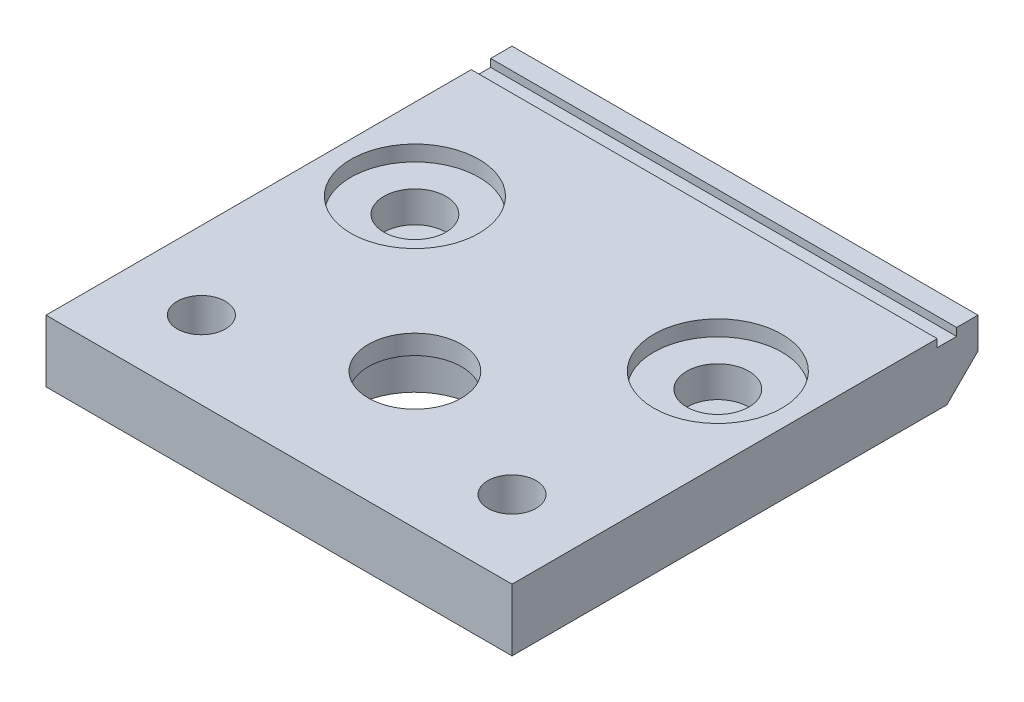
ISO-10303-21;
HEADER;
FILE_DESCRIPTION(('STEP AP214'),'2;1');
FILE_NAME('part.step','',(''),(''),'','','');
FILE_SCHEMA(('AUTOMOTIVE_DESIGN { 1 0 10303 214 1 1 1 1 }'));
ENDSEC;
DATA;
#1=APPLICATION_CONTEXT('core data for automotive mechanical design processes');
#2=APPLICATION_PROTOCOL_DEFINITION('international standard','automotive_design',2000,#1);
#3=PRODUCT_CONTEXT('',#1,'mechanical');
#4=PRODUCT('Part','Part','',(#3));
#5=PRODUCT_RELATED_PRODUCT_CATEGORY('part','',(#4));
#6=PRODUCT_DEFINITION_FORMATION('','',#4);
#7=PRODUCT_DEFINITION_CONTEXT('part definition',#1,'design');
#8=PRODUCT_DEFINITION('design','',#6,#7);
#9=PRODUCT_DEFINITION_SHAPE('','',#8);
#10=(LENGTH_UNIT() NAMED_UNIT(*) SI_UNIT(.MILLI.,.METRE.));
#11=(NAMED_UNIT(*) PLANE_ANGLE_UNIT() SI_UNIT($,.RADIAN.));
#12=(NAMED_UNIT(*) SI_UNIT($,.STERADIAN.) SOLID_ANGLE_UNIT());
#13=UNCERTAINTY_MEASURE_WITH_UNIT(LENGTH_MEASURE(1.E-05),#10,'distance_accuracy_value','');
#14=(GEOMETRIC_REPRESENTATION_CONTEXT(3) GLOBAL_UNCERTAINTY_ASSIGNED_CONTEXT((#13)) GLOBAL_UNIT_ASSIGNED_CONTEXT((#10,
#11,#12)) REPRESENTATION_CONTEXT('',''));
#15=CARTESIAN_POINT('',(0.,0.,0.));
#16=DIRECTION('',(0.,0.,1.));
#17=DIRECTION('',(1.,0.,0.));
#18=AXIS2_PLACEMENT_3D('',#15,#16,#17);
#19=CARTESIAN_POINT('',(0.,8.,0.));
#20=DIRECTION('',(0.,1.,0.));
#21=DIRECTION('',(0.,0.,1.));
#22=AXIS2_PLACEMENT_3D('',#19,#20,#21);
#23=PLANE('',#22);
#24=DIRECTION('',(1.,0.,0.));
#25=VECTOR('',#24,1.);
#26=CARTESIAN_POINT('',(-30.,8.,-24.75));
#27=LINE('',#26,#25);
#28=CARTESIAN_POINT('',(-30.,8.,-24.75));
#29=VERTEX_POINT('',#28);
#30=CARTESIAN_POINT('',(30.,8.,-24.75));
#31=VERTEX_POINT('',#30);
#32=EDGE_CURVE('E157',#29,#31,#27,.T.);
#33=ORIENTED_EDGE('',*,*,#32,.F.);
#34=DIRECTION('',(0.,0.,1.));
#35=VECTOR('',#34,1.);
#36=CARTESIAN_POINT('',(-30.,8.,0.));
#37=LINE('',#36,#35);
#38=CARTESIAN_POINT('',(-30.,8.,30.));
#39=VERTEX_POINT('',#38);
#40=EDGE_CURVE('E141',#29,#39,#37,.T.);
#41=ORIENTED_EDGE('',*,*,#40,.T.);
#42=DIRECTION('',(1.,0.,0.));
#43=VECTOR('',#42,1.);
#44=CARTESIAN_POINT('',(0.,8.,30.));
#45=LINE('',#44,#43);
#46=CARTESIAN_POINT('',(30.,8.,30.));
#47=VERTEX_POINT('',#46);
#48=EDGE_CURVE('E245',#39,#47,#45,.T.);
#49=ORIENTED_EDGE('',*,*,#48,.T.);
#50=DIRECTION('',(0.,0.,1.));
#51=VECTOR('',#50,1.);
#52=CARTESIAN_POINT('',(30.,8.,0.));
#53=LINE('',#52,#51);
#54=EDGE_CURVE('E231',#31,#47,#53,.T.);
#55=ORIENTED_EDGE('',*,*,#54,.F.);
#56=EDGE_LOOP('',(#33,#41,#49,#55));
#57=FACE_BOUND('',#56,.T.);
#58=CARTESIAN_POINT('',(-20.,8.,20.));
#59=DIRECTION('',(0.,-1.,0.));
#60=DIRECTION('',(0.,0.,-1.));
#61=AXIS2_PLACEMENT_3D('',#58,#59,#60);
#62=CIRCLE('',#61,3.1);
#63=CARTESIAN_POINT('',(-20.,8.,16.9));
#64=VERTEX_POINT('',#63);
#65=EDGE_CURVE('E174',#64,#64,#62,.T.);
#66=ORIENTED_EDGE('',*,*,#65,.T.);
#67=EDGE_LOOP('',(#66));
#68=FACE_BOUND('',#67,.T.);
#69=CARTESIAN_POINT('',(0.,8.,12.5));
#70=DIRECTION('',(0.,1.,0.));
#71=DIRECTION('',(0.,0.,1.));
#72=AXIS2_PLACEMENT_3D('',#69,#70,#71);
#73=CIRCLE('',#72,6.);
#74=CARTESIAN_POINT('',(0.,8.,18.5));
#75=VERTEX_POINT('',#74);
#76=EDGE_CURVE('E227',#75,#75,#73,.T.);
#77=ORIENTED_EDGE('',*,*,#76,.F.);
#78=EDGE_LOOP('',(#77));
#79=FACE_BOUND('',#78,.T.);
#80=CARTESIAN_POINT('',(19.5,8.,-6.99999999999999));
#81=DIRECTION('',(0.,1.,0.));
#82=DIRECTION('',(0.,0.,1.));
#83=AXIS2_PLACEMENT_3D('',#80,#81,#82);
#84=CIRCLE('',#83,8.25);
#85=CARTESIAN_POINT('',(19.5,8.,1.25000000000001));
#86=VERTEX_POINT('',#85);
#87=EDGE_CURVE('E189',#86,#86,#84,.T.);
#88=ORIENTED_EDGE('',*,*,#87,.F.);
#89=EDGE_LOOP('',(#88));
#90=FACE_BOUND('',#89,.T.);
#91=CARTESIAN_POINT('',(-19.5,8.,-6.99999999999999));
#92=DIRECTION('',(0.,1.,0.));
#93=DIRECTION('',(0.,0.,1.));
#94=AXIS2_PLACEMENT_3D('',#91,#92,#93);
#95=CIRCLE('',#94,8.25);
#96=CARTESIAN_POINT('',(-19.5,8.,1.25000000000001));
#97=VERTEX_POINT('',#96);
#98=EDGE_CURVE('E195',#97,#97,#95,.T.);
#99=ORIENTED_EDGE('',*,*,#98,.F.);
#100=EDGE_LOOP('',(#99));
#101=FACE_BOUND('',#100,.T.);
#102=CARTESIAN_POINT('',(20.,8.,20.));
#103=DIRECTION('',(0.,-1.,0.));
#104=DIRECTION('',(0.,0.,-1.));
#105=AXIS2_PLACEMENT_3D('',#102,#103,#104);
#106=CIRCLE('',#105,3.1);
#107=CARTESIAN_POINT('',(20.,8.,16.9));
#108=VERTEX_POINT('',#107);
#109=EDGE_CURVE('E186',#108,#108,#106,.T.);
#110=ORIENTED_EDGE('',*,*,#109,.T.);
#111=EDGE_LOOP('',(#110));
#112=FACE_BOUND('',#111,.T.);
#113=ADVANCED_FACE('F47',(#57,#68,#79,#90,#101,#112),#23,.T.);
#114=DIRECTION('',(1.,0.,0.));
#115=VECTOR('',#114,1.);
#116=CARTESIAN_POINT('',(-30.,8.,-27.25));
#117=LINE('',#116,#115);
#118=CARTESIAN_POINT('',(-30.,8.,-27.25));
#119=VERTEX_POINT('',#118);
#120=CARTESIAN_POINT('',(30.,8.,-27.25));
#121=VERTEX_POINT('',#120);
#122=EDGE_CURVE('E161',#119,#121,#117,.T.);
#123=ORIENTED_EDGE('',*,*,#122,.T.);
#124=CARTESIAN_POINT('',(30.,8.,-30.));
#125=VERTEX_POINT('',#124);
#126=EDGE_CURVE('E233',#125,#121,#53,.T.);
#127=ORIENTED_EDGE('',*,*,#126,.F.);
#128=DIRECTION('',(1.,0.,0.));
#129=VECTOR('',#128,1.);
#130=CARTESIAN_POINT('',(0.,8.,-30.));
#131=LINE('',#130,#129);
#132=CARTESIAN_POINT('',(-30.,8.,-30.));
#133=VERTEX_POINT('',#132);
#134=EDGE_CURVE('E237',#133,#125,#131,.T.);
#135=ORIENTED_EDGE('',*,*,#134,.F.);
#136=EDGE_CURVE('E241',#133,#119,#37,.T.);
#137=ORIENTED_EDGE('',*,*,#136,.T.);
#138=EDGE_LOOP('',(#123,#127,#135,#137));
#139=FACE_BOUND('',#138,.T.);
#140=ADVANCED_FACE('F308',(#139),#23,.T.);
#141=CARTESIAN_POINT('',(30.,8.,0.));
#142=DIRECTION('',(1.,0.,0.));
#143=DIRECTION('',(0.,0.,-1.));
#144=AXIS2_PLACEMENT_3D('',#141,#142,#143);
#145=PLANE('',#144);
#146=DIRECTION('',(0.,-1.,0.));
#147=VECTOR('',#146,1.);
#148=CARTESIAN_POINT('',(30.,7.,-24.75));
#149=LINE('',#148,#147);
#150=CARTESIAN_POINT('',(30.,7.,-24.75));
#151=VERTEX_POINT('',#150);
#152=EDGE_CURVE('E125',#31,#151,#149,.T.);
#153=ORIENTED_EDGE('',*,*,#152,.F.);
#154=ORIENTED_EDGE('',*,*,#54,.T.);
#155=DIRECTION('',(0.,-1.,0.));
#156=VECTOR('',#155,1.);
#157=CARTESIAN_POINT('',(30.,8.,30.));
#158=LINE('',#157,#156);
#159=CARTESIAN_POINT('',(30.,0.,30.));
#160=VERTEX_POINT('',#159);
#161=EDGE_CURVE('E249',#47,#160,#158,.T.);
#162=ORIENTED_EDGE('',*,*,#161,.T.);
#163=DIRECTION('',(0.,0.,1.));
#164=VECTOR('',#163,1.);
#165=CARTESIAN_POINT('',(30.,0.,0.));
#166=LINE('',#165,#164);
#167=CARTESIAN_POINT('',(30.,0.,-26.));
#168=VERTEX_POINT('',#167);
#169=EDGE_CURVE('E223',#168,#160,#166,.T.);
#170=ORIENTED_EDGE('',*,*,#169,.F.);
#171=DIRECTION('',(0.,0.707106781186549,-0.707106781186546));
#172=VECTOR('',#171,1.);
#173=CARTESIAN_POINT('',(30.,-8.99999999999999,-17.));
#174=LINE('',#173,#172);
#175=CARTESIAN_POINT('',(30.,4.00000000000001,-30.));
#176=VERTEX_POINT('',#175);
#177=EDGE_CURVE('E281',#168,#176,#174,.T.);
#178=ORIENTED_EDGE('',*,*,#177,.T.);
#179=DIRECTION('',(0.,-1.,0.));
#180=VECTOR('',#179,1.);
#181=CARTESIAN_POINT('',(30.,8.,-30.));
#182=LINE('',#181,#180);
#183=EDGE_CURVE('E268',#125,#176,#182,.T.);
#184=ORIENTED_EDGE('',*,*,#183,.F.);
#185=ORIENTED_EDGE('',*,*,#126,.T.);
#186=DIRECTION('',(0.,1.,0.));
#187=VECTOR('',#186,1.);
#188=CARTESIAN_POINT('',(30.,8.,-27.25));
#189=LINE('',#188,#187);
#190=CARTESIAN_POINT('',(30.,7.,-27.25));
#191=VERTEX_POINT('',#190);
#192=EDGE_CURVE('E143',#191,#121,#189,.T.);
#193=ORIENTED_EDGE('',*,*,#192,.F.);
#194=DIRECTION('',(0.,0.,-1.));
#195=VECTOR('',#194,1.);
#196=CARTESIAN_POINT('',(30.,7.,-27.25));
#197=LINE('',#196,#195);
#198=EDGE_CURVE('E148',#151,#191,#197,.T.);
#199=ORIENTED_EDGE('',*,*,#198,.F.);
#200=EDGE_LOOP('',(#153,#154,#162,#170,#178,#184,#185,#193,#199));
#201=FACE_BOUND('',#200,.T.);
#202=ADVANCED_FACE('F288',(#201),#145,.T.);
#203=CARTESIAN_POINT('',(0.,8.,-30.));
#204=DIRECTION('',(0.,0.,-1.));
#205=DIRECTION('',(-1.,0.,0.));
#206=AXIS2_PLACEMENT_3D('',#203,#204,#205);
#207=PLANE('',#206);
#208=ORIENTED_EDGE('',*,*,#183,.T.);
#209=DIRECTION('',(-1.,0.,0.));
#210=VECTOR('',#209,1.);
#211=CARTESIAN_POINT('',(-30.,4.00000000000001,-30.));
#212=LINE('',#211,#210);
#213=CARTESIAN_POINT('',(-30.,4.00000000000001,-30.));
#214=VERTEX_POINT('',#213);
#215=EDGE_CURVE('E57',#176,#214,#212,.T.);
#216=ORIENTED_EDGE('',*,*,#215,.T.);
#217=DIRECTION('',(0.,-1.,0.));
#218=VECTOR('',#217,1.);
#219=CARTESIAN_POINT('',(-30.,8.,-30.));
#220=LINE('',#219,#218);
#221=EDGE_CURVE('E265',#133,#214,#220,.T.);
#222=ORIENTED_EDGE('',*,*,#221,.F.);
#223=ORIENTED_EDGE('',*,*,#134,.T.);
#224=EDGE_LOOP('',(#208,#216,#222,#223));
#225=FACE_BOUND('',#224,.T.);
#226=ADVANCED_FACE('F303',(#225),#207,.T.);
#227=CARTESIAN_POINT('',(-30.,8.,0.));
#228=DIRECTION('',(1.,0.,0.));
#229=DIRECTION('',(0.,0.,-1.));
#230=AXIS2_PLACEMENT_3D('',#227,#228,#229);
#231=PLANE('',#230);
#232=ORIENTED_EDGE('',*,*,#40,.F.);
#233=DIRECTION('',(0.,-1.,0.));
#234=VECTOR('',#233,1.);
#235=CARTESIAN_POINT('',(-30.,7.,-24.75));
#236=LINE('',#235,#234);
#237=CARTESIAN_POINT('',(-30.,7.,-24.75));
#238=VERTEX_POINT('',#237);
#239=EDGE_CURVE('E122',#29,#238,#236,.T.);
#240=ORIENTED_EDGE('',*,*,#239,.T.);
#241=DIRECTION('',(0.,0.,-1.));
#242=VECTOR('',#241,1.);
#243=CARTESIAN_POINT('',(-30.,7.,-27.25));
#244=LINE('',#243,#242);
#245=CARTESIAN_POINT('',(-30.,7.,-27.25));
#246=VERTEX_POINT('',#245);
#247=EDGE_CURVE('E133',#238,#246,#244,.T.);
#248=ORIENTED_EDGE('',*,*,#247,.T.);
#249=DIRECTION('',(0.,1.,0.));
#250=VECTOR('',#249,1.);
#251=CARTESIAN_POINT('',(-30.,8.,-27.25));
#252=LINE('',#251,#250);
#253=EDGE_CURVE('E64',#246,#119,#252,.T.);
#254=ORIENTED_EDGE('',*,*,#253,.T.);
#255=ORIENTED_EDGE('',*,*,#136,.F.);
#256=ORIENTED_EDGE('',*,*,#221,.T.);
#257=DIRECTION('',(0.,-0.707106781186549,0.707106781186546));
#258=VECTOR('',#257,1.);
#259=CARTESIAN_POINT('',(-30.,0.,-26.));
#260=LINE('',#259,#258);
#261=CARTESIAN_POINT('',(-30.,0.,-26.));
#262=VERTEX_POINT('',#261);
#263=EDGE_CURVE('E11',#214,#262,#260,.T.);
#264=ORIENTED_EDGE('',*,*,#263,.T.);
#265=DIRECTION('',(0.,0.,1.));
#266=VECTOR('',#265,1.);
#267=CARTESIAN_POINT('',(-30.,0.,0.));
#268=LINE('',#267,#266);
#269=CARTESIAN_POINT('',(-30.,0.,30.));
#270=VERTEX_POINT('',#269);
#271=EDGE_CURVE('E252',#262,#270,#268,.T.);
#272=ORIENTED_EDGE('',*,*,#271,.T.);
#273=DIRECTION('',(0.,-1.,0.));
#274=VECTOR('',#273,1.);
#275=CARTESIAN_POINT('',(-30.,8.,30.));
#276=LINE('',#275,#274);
#277=EDGE_CURVE('E261',#39,#270,#276,.T.);
#278=ORIENTED_EDGE('',*,*,#277,.F.);
#279=EDGE_LOOP('',(#232,#240,#248,#254,#255,#256,#264,#272,#278));
#280=FACE_BOUND('',#279,.T.);
#281=ADVANCED_FACE('F139',(#280),#231,.F.);
#282=CARTESIAN_POINT('',(0.,8.,30.));
#283=DIRECTION('',(0.,0.,-1.));
#284=DIRECTION('',(-1.,0.,0.));
#285=AXIS2_PLACEMENT_3D('',#282,#283,#284);
#286=PLANE('',#285);
#287=DIRECTION('',(1.,0.,0.));
#288=VECTOR('',#287,1.);
#289=CARTESIAN_POINT('',(0.,0.,30.));
#290=LINE('',#289,#288);
#291=EDGE_CURVE('E232',#270,#160,#290,.T.);
#292=ORIENTED_EDGE('',*,*,#291,.T.);
#293=ORIENTED_EDGE('',*,*,#161,.F.);
#294=ORIENTED_EDGE('',*,*,#48,.F.);
#295=ORIENTED_EDGE('',*,*,#277,.T.);
#296=EDGE_LOOP('',(#292,#293,#294,#295));
#297=FACE_BOUND('',#296,.T.);
#298=ADVANCED_FACE('F295',(#297),#286,.F.);
#299=CARTESIAN_POINT('',(0.,8.,12.5));
#300=DIRECTION('',(0.,-1.,0.));
#301=DIRECTION('',(0.,0.,-1.));
#302=AXIS2_PLACEMENT_3D('',#299,#300,#301);
#303=CYLINDRICAL_SURFACE('',#302,6.);
#304=CARTESIAN_POINT('',(0.,5.5,12.5));
#305=DIRECTION('',(0.,1.,0.));
#306=DIRECTION('',(0.,0.,1.));
#307=AXIS2_PLACEMENT_3D('',#304,#305,#306);
#308=CIRCLE('',#307,6.);
#309=CARTESIAN_POINT('',(0.,5.5,18.5));
#310=VERTEX_POINT('',#309);
#311=EDGE_CURVE('E206',#310,#310,#308,.T.);
#312=ORIENTED_EDGE('',*,*,#311,.F.);
#313=EDGE_LOOP('',(#312));
#314=FACE_BOUND('',#313,.T.);
#315=ORIENTED_EDGE('',*,*,#76,.T.);
#316=EDGE_LOOP('',(#315));
#317=FACE_BOUND('',#316,.T.);
#318=ADVANCED_FACE('F332',(#314,#317),#303,.F.);
#319=CARTESIAN_POINT('',(0.,0.,0.));
#320=DIRECTION('',(0.,1.,0.));
#321=DIRECTION('',(0.,0.,1.));
#322=AXIS2_PLACEMENT_3D('',#319,#320,#321);
#323=PLANE('',#322);
#324=CARTESIAN_POINT('',(-20.,0.,20.));
#325=DIRECTION('',(0.,-1.,0.));
#326=DIRECTION('',(0.,0.,-1.));
#327=AXIS2_PLACEMENT_3D('',#324,#325,#326);
#328=CIRCLE('',#327,6.25);
#329=CARTESIAN_POINT('',(-20.,0.,13.75));
#330=VERTEX_POINT('',#329);
#331=EDGE_CURVE('E160',#330,#330,#328,.T.);
#332=ORIENTED_EDGE('',*,*,#331,.F.);
#333=EDGE_LOOP('',(#332));
#334=FACE_BOUND('',#333,.T.);
#335=CARTESIAN_POINT('',(20.,0.,20.));
#336=DIRECTION('',(0.,-1.,0.));
#337=DIRECTION('',(0.,0.,-1.));
#338=AXIS2_PLACEMENT_3D('',#335,#336,#337);
#339=CIRCLE('',#338,6.25);
#340=CARTESIAN_POINT('',(20.,0.,13.75));
#341=VERTEX_POINT('',#340);
#342=EDGE_CURVE('E178',#341,#341,#339,.T.);
#343=ORIENTED_EDGE('',*,*,#342,.F.);
#344=EDGE_LOOP('',(#343));
#345=FACE_BOUND('',#344,.T.);
#346=CARTESIAN_POINT('',(0.,0.,12.5));
#347=DIRECTION('',(0.,1.,0.));
#348=DIRECTION('',(0.,0.,1.));
#349=AXIS2_PLACEMENT_3D('',#346,#347,#348);
#350=CIRCLE('',#349,8.);
#351=CARTESIAN_POINT('',(0.,0.,20.5));
#352=VERTEX_POINT('',#351);
#353=EDGE_CURVE('E210',#352,#352,#350,.T.);
#354=ORIENTED_EDGE('',*,*,#353,.T.);
#355=EDGE_LOOP('',(#354));
#356=FACE_BOUND('',#355,.T.);
#357=ORIENTED_EDGE('',*,*,#271,.F.);
#358=DIRECTION('',(1.,0.,0.));
#359=VECTOR('',#358,1.);
#360=CARTESIAN_POINT('',(30.,0.,-26.));
#361=LINE('',#360,#359);
#362=EDGE_CURVE('E271',#262,#168,#361,.T.);
#363=ORIENTED_EDGE('',*,*,#362,.T.);
#364=ORIENTED_EDGE('',*,*,#169,.T.);
#365=ORIENTED_EDGE('',*,*,#291,.F.);
#366=EDGE_LOOP('',(#357,#363,#364,#365));
#367=FACE_BOUND('',#366,.T.);
#368=ADVANCED_FACE('F299',(#334,#345,#356,#367),#323,.F.);
#369=CARTESIAN_POINT('',(0.,5.5,12.5));
#370=DIRECTION('',(0.,-1.,0.));
#371=DIRECTION('',(0.,0.,-1.));
#372=AXIS2_PLACEMENT_3D('',#369,#370,#371);
#373=CYLINDRICAL_SURFACE('',#372,8.);
#374=CARTESIAN_POINT('',(0.,5.5,12.5));
#375=DIRECTION('',(0.,1.,0.));
#376=DIRECTION('',(0.,0.,1.));
#377=AXIS2_PLACEMENT_3D('',#374,#375,#376);
#378=CIRCLE('',#377,8.);
#379=CARTESIAN_POINT('',(0.,5.5,20.5));
#380=VERTEX_POINT('',#379);
#381=EDGE_CURVE('E209',#380,#380,#378,.T.);
#382=ORIENTED_EDGE('',*,*,#381,.T.);
#383=EDGE_LOOP('',(#382));
#384=FACE_BOUND('',#383,.T.);
#385=ORIENTED_EDGE('',*,*,#353,.F.);
#386=EDGE_LOOP('',(#385));
#387=FACE_BOUND('',#386,.T.);
#388=ADVANCED_FACE('F331',(#384,#387),#373,.F.);
#389=CARTESIAN_POINT('',(0.,5.5,0.));
#390=DIRECTION('',(0.,1.,0.));
#391=DIRECTION('',(0.,0.,1.));
#392=AXIS2_PLACEMENT_3D('',#389,#390,#391);
#393=PLANE('',#392);
#394=ORIENTED_EDGE('',*,*,#311,.T.);
#395=EDGE_LOOP('',(#394));
#396=FACE_BOUND('',#395,.T.);
#397=ORIENTED_EDGE('',*,*,#381,.F.);
#398=EDGE_LOOP('',(#397));
#399=FACE_BOUND('',#398,.T.);
#400=ADVANCED_FACE('F373',(#396,#399),#393,.F.);
#401=CARTESIAN_POINT('',(-19.5,6.,-6.99999999999999));
#402=DIRECTION('',(0.,1.,0.));
#403=DIRECTION('',(0.,0.,1.));
#404=AXIS2_PLACEMENT_3D('',#401,#402,#403);
#405=PLANE('',#404);
#406=CARTESIAN_POINT('',(-19.5,6.,-6.99999999999999));
#407=DIRECTION('',(0.,1.,0.));
#408=DIRECTION('',(0.,0.,1.));
#409=AXIS2_PLACEMENT_3D('',#406,#407,#408);
#410=CIRCLE('',#409,8.25);
#411=CARTESIAN_POINT('',(-19.5,6.,1.25000000000001));
#412=VERTEX_POINT('',#411);
#413=EDGE_CURVE('E190',#412,#412,#410,.T.);
#414=ORIENTED_EDGE('',*,*,#413,.T.);
#415=EDGE_LOOP('',(#414));
#416=FACE_BOUND('',#415,.T.);
#417=CARTESIAN_POINT('',(-19.5,6.,-6.99999999999999));
#418=DIRECTION('',(0.,1.,0.));
#419=DIRECTION('',(0.,0.,1.));
#420=AXIS2_PLACEMENT_3D('',#417,#418,#419);
#421=CIRCLE('',#420,4.);
#422=CARTESIAN_POINT('',(-19.5,6.,-2.99999999999999));
#423=VERTEX_POINT('',#422);
#424=EDGE_CURVE('E194',#423,#423,#421,.F.);
#425=ORIENTED_EDGE('',*,*,#424,.T.);
#426=EDGE_LOOP('',(#425));
#427=FACE_BOUND('',#426,.T.);
#428=ADVANCED_FACE('F379',(#416,#427),#405,.T.);
#429=CARTESIAN_POINT('',(-19.5,6.,-6.99999999999999));
#430=DIRECTION('',(0.,1.,0.));
#431=DIRECTION('',(0.,0.,1.));
#432=AXIS2_PLACEMENT_3D('',#429,#430,#431);
#433=CYLINDRICAL_SURFACE('',#432,8.25);
#434=ORIENTED_EDGE('',*,*,#413,.F.);
#435=EDGE_LOOP('',(#434));
#436=FACE_BOUND('',#435,.T.);
#437=ORIENTED_EDGE('',*,*,#98,.T.);
#438=EDGE_LOOP('',(#437));
#439=FACE_BOUND('',#438,.T.);
#440=ADVANCED_FACE('F405',(#436,#439),#433,.F.);
#441=CARTESIAN_POINT('',(19.5,6.,-6.99999999999999));
#442=DIRECTION('',(0.,1.,0.));
#443=DIRECTION('',(0.,0.,1.));
#444=AXIS2_PLACEMENT_3D('',#441,#442,#443);
#445=PLANE('',#444);
#446=CARTESIAN_POINT('',(19.5,6.,-6.99999999999999));
#447=DIRECTION('',(0.,1.,0.));
#448=DIRECTION('',(0.,0.,1.));
#449=AXIS2_PLACEMENT_3D('',#446,#447,#448);
#450=CIRCLE('',#449,8.25);
#451=CARTESIAN_POINT('',(19.5,6.,1.25000000000001));
#452=VERTEX_POINT('',#451);
#453=EDGE_CURVE('E199',#452,#452,#450,.T.);
#454=ORIENTED_EDGE('',*,*,#453,.T.);
#455=EDGE_LOOP('',(#454));
#456=FACE_BOUND('',#455,.T.);
#457=CARTESIAN_POINT('',(19.5,6.,-6.99999999999999));
#458=DIRECTION('',(0.,1.,0.));
#459=DIRECTION('',(0.,0.,1.));
#460=AXIS2_PLACEMENT_3D('',#457,#458,#459);
#461=CIRCLE('',#460,4.);
#462=CARTESIAN_POINT('',(19.5,6.,-2.99999999999999));
#463=VERTEX_POINT('',#462);
#464=EDGE_CURVE('E218',#463,#463,#461,.F.);
#465=ORIENTED_EDGE('',*,*,#464,.T.);
#466=EDGE_LOOP('',(#465));
#467=FACE_BOUND('',#466,.T.);
#468=ADVANCED_FACE('F403',(#456,#467),#445,.T.);
#469=CARTESIAN_POINT('',(19.5,6.,-6.99999999999999));
#470=DIRECTION('',(0.,1.,0.));
#471=DIRECTION('',(0.,0.,1.));
#472=AXIS2_PLACEMENT_3D('',#469,#470,#471);
#473=CYLINDRICAL_SURFACE('',#472,8.25);
#474=ORIENTED_EDGE('',*,*,#453,.F.);
#475=EDGE_LOOP('',(#474));
#476=FACE_BOUND('',#475,.T.);
#477=ORIENTED_EDGE('',*,*,#87,.T.);
#478=EDGE_LOOP('',(#477));
#479=FACE_BOUND('',#478,.T.);
#480=ADVANCED_FACE('F388',(#476,#479),#473,.F.);
#481=CARTESIAN_POINT('',(-19.5,2.,-6.99999999999999));
#482=DIRECTION('',(0.,1.,0.));
#483=DIRECTION('',(0.,0.,1.));
#484=AXIS2_PLACEMENT_3D('',#481,#482,#483);
#485=PLANE('',#484);
#486=CARTESIAN_POINT('',(-19.5,2.,-6.99999999999999));
#487=DIRECTION('',(0.,1.,0.));
#488=DIRECTION('',(0.,0.,1.));
#489=AXIS2_PLACEMENT_3D('',#486,#487,#488);
#490=CIRCLE('',#489,4.);
#491=CARTESIAN_POINT('',(-19.5,2.,-2.99999999999999));
#492=VERTEX_POINT('',#491);
#493=EDGE_CURVE('E219',#492,#492,#490,.T.);
#494=ORIENTED_EDGE('',*,*,#493,.T.);
#495=EDGE_LOOP('',(#494));
#496=FACE_BOUND('',#495,.T.);
#497=ADVANCED_FACE('F384',(#496),#485,.T.);
#498=CARTESIAN_POINT('',(-19.5,2.,-6.99999999999999));
#499=DIRECTION('',(0.,1.,0.));
#500=DIRECTION('',(0.,0.,1.));
#501=AXIS2_PLACEMENT_3D('',#498,#499,#500);
#502=CYLINDRICAL_SURFACE('',#501,4.);
#503=ORIENTED_EDGE('',*,*,#493,.F.);
#504=EDGE_LOOP('',(#503));
#505=FACE_BOUND('',#504,.T.);
#506=ORIENTED_EDGE('',*,*,#424,.F.);
#507=EDGE_LOOP('',(#506));
#508=FACE_BOUND('',#507,.T.);
#509=ADVANCED_FACE('F387',(#505,#508),#502,.F.);
#510=CARTESIAN_POINT('',(19.5,2.,-6.99999999999999));
#511=DIRECTION('',(0.,-1.,0.));
#512=DIRECTION('',(0.,0.,-1.));
#513=AXIS2_PLACEMENT_3D('',#510,#511,#512);
#514=PLANE('',#513);
#515=CARTESIAN_POINT('',(19.5,2.,-6.99999999999999));
#516=DIRECTION('',(0.,1.,0.));
#517=DIRECTION('',(0.,0.,-1.));
#518=AXIS2_PLACEMENT_3D('',#515,#516,#517);
#519=CIRCLE('',#518,4.);
#520=CARTESIAN_POINT('',(19.5,2.,-11.));
#521=VERTEX_POINT('',#520);
#522=EDGE_CURVE('E214',#521,#521,#519,.T.);
#523=ORIENTED_EDGE('',*,*,#522,.T.);
#524=EDGE_LOOP('',(#523));
#525=FACE_BOUND('',#524,.T.);
#526=ADVANCED_FACE('F391',(#525),#514,.F.);
#527=CARTESIAN_POINT('',(19.5,2.,-6.99999999999999));
#528=DIRECTION('',(0.,1.,0.));
#529=DIRECTION('',(0.,0.,1.));
#530=AXIS2_PLACEMENT_3D('',#527,#528,#529);
#531=CYLINDRICAL_SURFACE('',#530,4.);
#532=ORIENTED_EDGE('',*,*,#522,.F.);
#533=EDGE_LOOP('',(#532));
#534=FACE_BOUND('',#533,.T.);
#535=ORIENTED_EDGE('',*,*,#464,.F.);
#536=EDGE_LOOP('',(#535));
#537=FACE_BOUND('',#536,.T.);
#538=ADVANCED_FACE('F327',(#534,#537),#531,.F.);
#539=CARTESIAN_POINT('',(0.,0.,-26.));
#540=DIRECTION('',(0.,-0.707106781186546,-0.707106781186549));
#541=DIRECTION('',(-1.,0.,0.));
#542=AXIS2_PLACEMENT_3D('',#539,#540,#541);
#543=PLANE('',#542);
#544=ORIENTED_EDGE('',*,*,#263,.F.);
#545=ORIENTED_EDGE('',*,*,#215,.F.);
#546=ORIENTED_EDGE('',*,*,#177,.F.);
#547=ORIENTED_EDGE('',*,*,#362,.F.);
#548=EDGE_LOOP('',(#544,#545,#546,#547));
#549=FACE_BOUND('',#548,.T.);
#550=ADVANCED_FACE('F50',(#549),#543,.T.);
#551=CARTESIAN_POINT('',(20.,0.,20.));
#552=DIRECTION('',(0.,-1.,0.));
#553=DIRECTION('',(0.,0.,-1.));
#554=AXIS2_PLACEMENT_3D('',#551,#552,#553);
#555=CYLINDRICAL_SURFACE('',#554,3.1);
#556=ORIENTED_EDGE('',*,*,#109,.F.);
#557=EDGE_LOOP('',(#556));
#558=FACE_BOUND('',#557,.T.);
#559=CARTESIAN_POINT('',(20.,3.15,20.));
#560=DIRECTION('',(0.,-1.,0.));
#561=DIRECTION('',(0.,0.,-1.));
#562=AXIS2_PLACEMENT_3D('',#559,#560,#561);
#563=CIRCLE('',#562,3.1);
#564=CARTESIAN_POINT('',(20.,3.15,16.9));
#565=VERTEX_POINT('',#564);
#566=EDGE_CURVE('E182',#565,#565,#563,.T.);
#567=ORIENTED_EDGE('',*,*,#566,.T.);
#568=EDGE_LOOP('',(#567));
#569=FACE_BOUND('',#568,.T.);
#570=ADVANCED_FACE('F356',(#558,#569),#555,.F.);
#571=CARTESIAN_POINT('',(20.,0.,20.));
#572=DIRECTION('',(0.,-1.,0.));
#573=DIRECTION('',(0.,0.,-1.));
#574=AXIS2_PLACEMENT_3D('',#571,#572,#573);
#575=CONICAL_SURFACE('',#574,6.25,0.785398163397449);
#576=ORIENTED_EDGE('',*,*,#566,.F.);
#577=EDGE_LOOP('',(#576));
#578=FACE_BOUND('',#577,.T.);
#579=ORIENTED_EDGE('',*,*,#342,.T.);
#580=EDGE_LOOP('',(#579));
#581=FACE_BOUND('',#580,.T.);
#582=ADVANCED_FACE('F359',(#578,#581),#575,.F.);
#583=CARTESIAN_POINT('',(-20.,0.,20.));
#584=DIRECTION('',(0.,-1.,0.));
#585=DIRECTION('',(0.,0.,-1.));
#586=AXIS2_PLACEMENT_3D('',#583,#584,#585);
#587=CYLINDRICAL_SURFACE('',#586,3.1);
#588=ORIENTED_EDGE('',*,*,#65,.F.);
#589=EDGE_LOOP('',(#588));
#590=FACE_BOUND('',#589,.T.);
#591=CARTESIAN_POINT('',(-20.,3.15,20.));
#592=DIRECTION('',(0.,-1.,0.));
#593=DIRECTION('',(0.,0.,-1.));
#594=AXIS2_PLACEMENT_3D('',#591,#592,#593);
#595=CIRCLE('',#594,3.1);
#596=CARTESIAN_POINT('',(-20.,3.15,16.9));
#597=VERTEX_POINT('',#596);
#598=EDGE_CURVE('E170',#597,#597,#595,.T.);
#599=ORIENTED_EDGE('',*,*,#598,.T.);
#600=EDGE_LOOP('',(#599));
#601=FACE_BOUND('',#600,.T.);
#602=ADVANCED_FACE('F365',(#590,#601),#587,.F.);
#603=CARTESIAN_POINT('',(-20.,0.,20.));
#604=DIRECTION('',(0.,-1.,0.));
#605=DIRECTION('',(0.,0.,-1.));
#606=AXIS2_PLACEMENT_3D('',#603,#604,#605);
#607=CONICAL_SURFACE('',#606,6.25,0.785398163397449);
#608=ORIENTED_EDGE('',*,*,#598,.F.);
#609=EDGE_LOOP('',(#608));
#610=FACE_BOUND('',#609,.T.);
#611=ORIENTED_EDGE('',*,*,#331,.T.);
#612=EDGE_LOOP('',(#611));
#613=FACE_BOUND('',#612,.T.);
#614=ADVANCED_FACE('F318',(#610,#613),#607,.F.);
#615=CARTESIAN_POINT('',(-30.,7.,-24.75));
#616=DIRECTION('',(0.,0.,1.));
#617=DIRECTION('',(1.,0.,0.));
#618=AXIS2_PLACEMENT_3D('',#615,#616,#617);
#619=PLANE('',#618);
#620=ORIENTED_EDGE('',*,*,#152,.T.);
#621=DIRECTION('',(1.,0.,0.));
#622=VECTOR('',#621,1.);
#623=CARTESIAN_POINT('',(-30.,7.,-24.75));
#624=LINE('',#623,#622);
#625=EDGE_CURVE('E118',#238,#151,#624,.T.);
#626=ORIENTED_EDGE('',*,*,#625,.F.);
#627=ORIENTED_EDGE('',*,*,#239,.F.);
#628=ORIENTED_EDGE('',*,*,#32,.T.);
#629=EDGE_LOOP('',(#620,#626,#627,#628));
#630=FACE_BOUND('',#629,.T.);
#631=ADVANCED_FACE('F120',(#630),#619,.F.);
#632=CARTESIAN_POINT('',(-30.,8.,-27.25));
#633=DIRECTION('',(0.,0.,-1.));
#634=DIRECTION('',(-1.,0.,0.));
#635=AXIS2_PLACEMENT_3D('',#632,#633,#634);
#636=PLANE('',#635);
#637=ORIENTED_EDGE('',*,*,#192,.T.);
#638=ORIENTED_EDGE('',*,*,#122,.F.);
#639=ORIENTED_EDGE('',*,*,#253,.F.);
#640=DIRECTION('',(1.,0.,0.));
#641=VECTOR('',#640,1.);
#642=CARTESIAN_POINT('',(-30.,7.,-27.25));
#643=LINE('',#642,#641);
#644=EDGE_CURVE('E130',#246,#191,#643,.T.);
#645=ORIENTED_EDGE('',*,*,#644,.T.);
#646=EDGE_LOOP('',(#637,#638,#639,#645));
#647=FACE_BOUND('',#646,.T.);
#648=ADVANCED_FACE('F310',(#647),#636,.F.);
#649=CARTESIAN_POINT('',(-30.,7.,-27.25));
#650=DIRECTION('',(0.,-1.,0.));
#651=DIRECTION('',(0.,0.,-1.));
#652=AXIS2_PLACEMENT_3D('',#649,#650,#651);
#653=PLANE('',#652);
#654=ORIENTED_EDGE('',*,*,#198,.T.);
#655=ORIENTED_EDGE('',*,*,#644,.F.);
#656=ORIENTED_EDGE('',*,*,#247,.F.);
#657=ORIENTED_EDGE('',*,*,#625,.T.);
#658=EDGE_LOOP('',(#654,#655,#656,#657));
#659=FACE_BOUND('',#658,.T.);
#660=ADVANCED_FACE('F134',(#659),#653,.F.);
#661=CLOSED_SHELL('',(#113,#140,#202,#226,#281,#298,#318,#368,#388,#400,#428,#440,#468,#480,
#497,#509,#526,#538,#550,#570,#582,#602,#614,#631,#648,#660));
#662=MANIFOLD_SOLID_BREP('B2',#661);
#663=ADVANCED_BREP_SHAPE_REPRESENTATION('',(#18,#662),#14);
#664=SHAPE_DEFINITION_REPRESENTATION(#9,#663);
ENDSEC;
END-ISO-10303-21;
